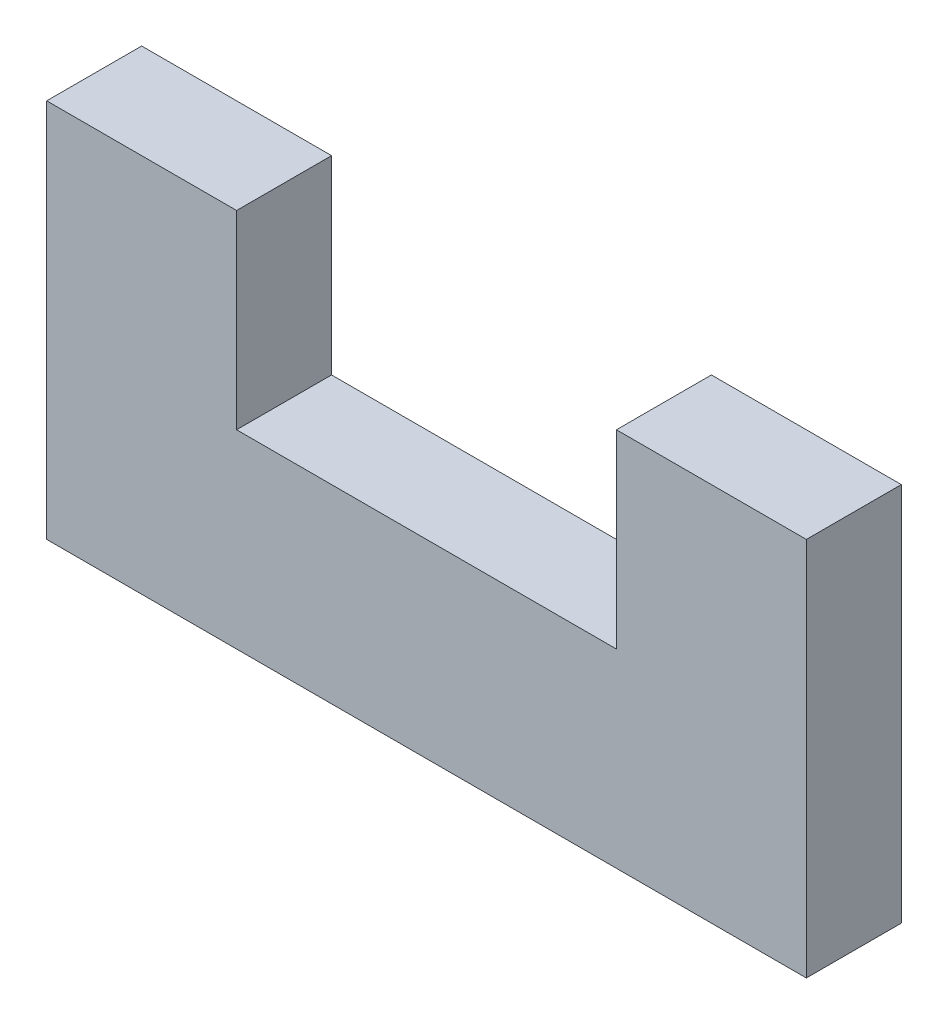
ISO-10303-21;
HEADER;
FILE_DESCRIPTION(('STEP AP214'),'2;1');
FILE_NAME('part.step','',(''),(''),'','','');
FILE_SCHEMA(('AUTOMOTIVE_DESIGN { 1 0 10303 214 1 1 1 1 }'));
ENDSEC;
DATA;
#1=APPLICATION_CONTEXT('core data for automotive mechanical design processes');
#2=APPLICATION_PROTOCOL_DEFINITION('international standard','automotive_design',2000,#1);
#3=PRODUCT_CONTEXT('',#1,'mechanical');
#4=PRODUCT('Part','Part','',(#3));
#5=PRODUCT_RELATED_PRODUCT_CATEGORY('part','',(#4));
#6=PRODUCT_DEFINITION_FORMATION('','',#4);
#7=PRODUCT_DEFINITION_CONTEXT('part definition',#1,'design');
#8=PRODUCT_DEFINITION('design','',#6,#7);
#9=PRODUCT_DEFINITION_SHAPE('','',#8);
#10=(LENGTH_UNIT() NAMED_UNIT(*) SI_UNIT(.MILLI.,.METRE.));
#11=(NAMED_UNIT(*) PLANE_ANGLE_UNIT() SI_UNIT($,.RADIAN.));
#12=(NAMED_UNIT(*) SI_UNIT($,.STERADIAN.) SOLID_ANGLE_UNIT());
#13=UNCERTAINTY_MEASURE_WITH_UNIT(LENGTH_MEASURE(1.E-05),#10,'distance_accuracy_value','');
#14=(GEOMETRIC_REPRESENTATION_CONTEXT(3) GLOBAL_UNCERTAINTY_ASSIGNED_CONTEXT((#13)) GLOBAL_UNIT_ASSIGNED_CONTEXT((#10,
#11,#12)) REPRESENTATION_CONTEXT('',''));
#15=CARTESIAN_POINT('',(0.,0.,0.));
#16=DIRECTION('',(0.,0.,1.));
#17=DIRECTION('',(1.,0.,0.));
#18=AXIS2_PLACEMENT_3D('',#15,#16,#17);
#19=CARTESIAN_POINT('',(3.,1.5,1.5));
#20=DIRECTION('',(1.,0.,0.));
#21=DIRECTION('',(0.,0.,-1.));
#22=AXIS2_PLACEMENT_3D('',#19,#20,#21);
#23=PLANE('',#22);
#24=DIRECTION('',(0.,-1.,0.));
#25=VECTOR('',#24,1.);
#26=CARTESIAN_POINT('',(3.,1.5,0.));
#27=LINE('',#26,#25);
#28=CARTESIAN_POINT('',(3.,1.5,0.));
#29=VERTEX_POINT('',#28);
#30=CARTESIAN_POINT('',(3.,-1.5,0.));
#31=VERTEX_POINT('',#30);
#32=EDGE_CURVE('E129',#29,#31,#27,.T.);
#33=ORIENTED_EDGE('',*,*,#32,.T.);
#34=DIRECTION('',(0.,0.,-1.));
#35=VECTOR('',#34,1.);
#36=CARTESIAN_POINT('',(3.,-1.5,1.5));
#37=LINE('',#36,#35);
#38=CARTESIAN_POINT('',(3.,-1.5,1.5));
#39=VERTEX_POINT('',#38);
#40=EDGE_CURVE('E11',#39,#31,#37,.T.);
#41=ORIENTED_EDGE('',*,*,#40,.F.);
#42=DIRECTION('',(0.,-1.,0.));
#43=VECTOR('',#42,1.);
#44=CARTESIAN_POINT('',(3.,1.5,1.5));
#45=LINE('',#44,#43);
#46=CARTESIAN_POINT('',(3.,1.5,1.5));
#47=VERTEX_POINT('',#46);
#48=EDGE_CURVE('E143',#47,#39,#45,.T.);
#49=ORIENTED_EDGE('',*,*,#48,.F.);
#50=DIRECTION('',(0.,0.,-1.));
#51=VECTOR('',#50,1.);
#52=CARTESIAN_POINT('',(3.,1.5,1.5));
#53=LINE('',#52,#51);
#54=EDGE_CURVE('E125',#47,#29,#53,.T.);
#55=ORIENTED_EDGE('',*,*,#54,.T.);
#56=EDGE_LOOP('',(#33,#41,#49,#55));
#57=FACE_BOUND('',#56,.T.);
#58=ADVANCED_FACE('F33',(#57),#23,.F.);
#59=CARTESIAN_POINT('',(-3.,-1.5,1.5));
#60=DIRECTION('',(0.,-1.,0.));
#61=DIRECTION('',(1.,0.,0.));
#62=AXIS2_PLACEMENT_3D('',#59,#60,#61);
#63=PLANE('',#62);
#64=DIRECTION('',(-1.,0.,0.));
#65=VECTOR('',#64,1.);
#66=CARTESIAN_POINT('',(-3.,-1.5,0.));
#67=LINE('',#66,#65);
#68=CARTESIAN_POINT('',(-3.,-1.5,0.));
#69=VERTEX_POINT('',#68);
#70=EDGE_CURVE('E132',#31,#69,#67,.T.);
#71=ORIENTED_EDGE('',*,*,#70,.T.);
#72=DIRECTION('',(0.,0.,-1.));
#73=VECTOR('',#72,1.);
#74=CARTESIAN_POINT('',(-3.,-1.5,1.5));
#75=LINE('',#74,#73);
#76=CARTESIAN_POINT('',(-3.,-1.5,1.5));
#77=VERTEX_POINT('',#76);
#78=EDGE_CURVE('E41',#77,#69,#75,.T.);
#79=ORIENTED_EDGE('',*,*,#78,.F.);
#80=DIRECTION('',(-1.,0.,0.));
#81=VECTOR('',#80,1.);
#82=CARTESIAN_POINT('',(-3.,-1.5,1.5));
#83=LINE('',#82,#81);
#84=EDGE_CURVE('E92',#39,#77,#83,.T.);
#85=ORIENTED_EDGE('',*,*,#84,.F.);
#86=ORIENTED_EDGE('',*,*,#40,.T.);
#87=EDGE_LOOP('',(#71,#79,#85,#86));
#88=FACE_BOUND('',#87,.T.);
#89=ADVANCED_FACE('F178',(#88),#63,.F.);
#90=CARTESIAN_POINT('',(-3.,1.5,1.5));
#91=DIRECTION('',(-1.,0.,0.));
#92=DIRECTION('',(0.,0.,1.));
#93=AXIS2_PLACEMENT_3D('',#90,#91,#92);
#94=PLANE('',#93);
#95=DIRECTION('',(0.,1.,0.));
#96=VECTOR('',#95,1.);
#97=CARTESIAN_POINT('',(-3.,1.5,0.));
#98=LINE('',#97,#96);
#99=CARTESIAN_POINT('',(-3.,1.5,0.));
#100=VERTEX_POINT('',#99);
#101=EDGE_CURVE('E134',#69,#100,#98,.T.);
#102=ORIENTED_EDGE('',*,*,#101,.T.);
#103=DIRECTION('',(0.,0.,-1.));
#104=VECTOR('',#103,1.);
#105=CARTESIAN_POINT('',(-3.,1.5,1.5));
#106=LINE('',#105,#104);
#107=CARTESIAN_POINT('',(-3.,1.5,1.5));
#108=VERTEX_POINT('',#107);
#109=EDGE_CURVE('E150',#108,#100,#106,.T.);
#110=ORIENTED_EDGE('',*,*,#109,.F.);
#111=DIRECTION('',(0.,1.,0.));
#112=VECTOR('',#111,1.);
#113=CARTESIAN_POINT('',(-3.,1.5,1.5));
#114=LINE('',#113,#112);
#115=EDGE_CURVE('E158',#77,#108,#114,.T.);
#116=ORIENTED_EDGE('',*,*,#115,.F.);
#117=ORIENTED_EDGE('',*,*,#78,.T.);
#118=EDGE_LOOP('',(#102,#110,#116,#117));
#119=FACE_BOUND('',#118,.T.);
#120=ADVANCED_FACE('F156',(#119),#94,.F.);
#121=CARTESIAN_POINT('',(-6.,1.5,1.5));
#122=DIRECTION('',(0.,-1.,0.));
#123=DIRECTION('',(1.,0.,0.));
#124=AXIS2_PLACEMENT_3D('',#121,#122,#123);
#125=PLANE('',#124);
#126=DIRECTION('',(-1.,0.,0.));
#127=VECTOR('',#126,1.);
#128=CARTESIAN_POINT('',(-6.,1.5,0.));
#129=LINE('',#128,#127);
#130=CARTESIAN_POINT('',(-6.,1.5,0.));
#131=VERTEX_POINT('',#130);
#132=EDGE_CURVE('E136',#100,#131,#129,.T.);
#133=ORIENTED_EDGE('',*,*,#132,.T.);
#134=DIRECTION('',(0.,0.,-1.));
#135=VECTOR('',#134,1.);
#136=CARTESIAN_POINT('',(-6.,1.5,1.5));
#137=LINE('',#136,#135);
#138=CARTESIAN_POINT('',(-6.,1.5,1.5));
#139=VERTEX_POINT('',#138);
#140=EDGE_CURVE('E147',#139,#131,#137,.T.);
#141=ORIENTED_EDGE('',*,*,#140,.F.);
#142=DIRECTION('',(-1.,0.,0.));
#143=VECTOR('',#142,1.);
#144=CARTESIAN_POINT('',(-6.,1.5,1.5));
#145=LINE('',#144,#143);
#146=EDGE_CURVE('E170',#108,#139,#145,.T.);
#147=ORIENTED_EDGE('',*,*,#146,.F.);
#148=ORIENTED_EDGE('',*,*,#109,.T.);
#149=EDGE_LOOP('',(#133,#141,#147,#148));
#150=FACE_BOUND('',#149,.T.);
#151=ADVANCED_FACE('F166',(#150),#125,.F.);
#152=CARTESIAN_POINT('',(-6.,1.5,1.5));
#153=DIRECTION('',(1.,0.,0.));
#154=DIRECTION('',(0.,0.,-1.));
#155=AXIS2_PLACEMENT_3D('',#152,#153,#154);
#156=PLANE('',#155);
#157=DIRECTION('',(0.,-1.,0.));
#158=VECTOR('',#157,1.);
#159=CARTESIAN_POINT('',(-6.,1.5,0.));
#160=LINE('',#159,#158);
#161=CARTESIAN_POINT('',(-6.,-4.5,0.));
#162=VERTEX_POINT('',#161);
#163=EDGE_CURVE('E138',#131,#162,#160,.T.);
#164=ORIENTED_EDGE('',*,*,#163,.T.);
#165=DIRECTION('',(0.,0.,-1.));
#166=VECTOR('',#165,1.);
#167=CARTESIAN_POINT('',(-6.,-4.5,1.5));
#168=LINE('',#167,#166);
#169=CARTESIAN_POINT('',(-6.,-4.5,1.5));
#170=VERTEX_POINT('',#169);
#171=EDGE_CURVE('E120',#170,#162,#168,.T.);
#172=ORIENTED_EDGE('',*,*,#171,.F.);
#173=DIRECTION('',(0.,-1.,0.));
#174=VECTOR('',#173,1.);
#175=CARTESIAN_POINT('',(-6.,1.5,1.5));
#176=LINE('',#175,#174);
#177=EDGE_CURVE('E111',#139,#170,#176,.T.);
#178=ORIENTED_EDGE('',*,*,#177,.F.);
#179=ORIENTED_EDGE('',*,*,#140,.T.);
#180=EDGE_LOOP('',(#164,#172,#178,#179));
#181=FACE_BOUND('',#180,.T.);
#182=ADVANCED_FACE('F169',(#181),#156,.F.);
#183=CARTESIAN_POINT('',(-6.,-4.5,1.5));
#184=DIRECTION('',(0.,1.,0.));
#185=DIRECTION('',(-1.,0.,0.));
#186=AXIS2_PLACEMENT_3D('',#183,#184,#185);
#187=PLANE('',#186);
#188=DIRECTION('',(1.,0.,0.));
#189=VECTOR('',#188,1.);
#190=CARTESIAN_POINT('',(-6.,-4.5,0.));
#191=LINE('',#190,#189);
#192=CARTESIAN_POINT('',(6.,-4.5,0.));
#193=VERTEX_POINT('',#192);
#194=EDGE_CURVE('E119',#162,#193,#191,.T.);
#195=ORIENTED_EDGE('',*,*,#194,.T.);
#196=DIRECTION('',(0.,0.,-1.));
#197=VECTOR('',#196,1.);
#198=CARTESIAN_POINT('',(6.,-4.5,1.5));
#199=LINE('',#198,#197);
#200=CARTESIAN_POINT('',(6.,-4.5,1.5));
#201=VERTEX_POINT('',#200);
#202=EDGE_CURVE('E116',#201,#193,#199,.T.);
#203=ORIENTED_EDGE('',*,*,#202,.F.);
#204=DIRECTION('',(1.,0.,0.));
#205=VECTOR('',#204,1.);
#206=CARTESIAN_POINT('',(-6.,-4.5,1.5));
#207=LINE('',#206,#205);
#208=EDGE_CURVE('E105',#170,#201,#207,.T.);
#209=ORIENTED_EDGE('',*,*,#208,.F.);
#210=ORIENTED_EDGE('',*,*,#171,.T.);
#211=EDGE_LOOP('',(#195,#203,#209,#210));
#212=FACE_BOUND('',#211,.T.);
#213=ADVANCED_FACE('F117',(#212),#187,.F.);
#214=CARTESIAN_POINT('',(6.,1.5,1.5));
#215=DIRECTION('',(-1.,0.,0.));
#216=DIRECTION('',(0.,0.,1.));
#217=AXIS2_PLACEMENT_3D('',#214,#215,#216);
#218=PLANE('',#217);
#219=DIRECTION('',(0.,1.,0.));
#220=VECTOR('',#219,1.);
#221=CARTESIAN_POINT('',(6.,1.5,0.));
#222=LINE('',#221,#220);
#223=CARTESIAN_POINT('',(6.,1.5,0.));
#224=VERTEX_POINT('',#223);
#225=EDGE_CURVE('E78',#193,#224,#222,.T.);
#226=ORIENTED_EDGE('',*,*,#225,.T.);
#227=DIRECTION('',(0.,0.,-1.));
#228=VECTOR('',#227,1.);
#229=CARTESIAN_POINT('',(6.,1.5,1.5));
#230=LINE('',#229,#228);
#231=CARTESIAN_POINT('',(6.,1.5,1.5));
#232=VERTEX_POINT('',#231);
#233=EDGE_CURVE('E121',#232,#224,#230,.T.);
#234=ORIENTED_EDGE('',*,*,#233,.F.);
#235=DIRECTION('',(0.,1.,0.));
#236=VECTOR('',#235,1.);
#237=CARTESIAN_POINT('',(6.,1.5,1.5));
#238=LINE('',#237,#236);
#239=EDGE_CURVE('E109',#201,#232,#238,.T.);
#240=ORIENTED_EDGE('',*,*,#239,.F.);
#241=ORIENTED_EDGE('',*,*,#202,.T.);
#242=EDGE_LOOP('',(#226,#234,#240,#241));
#243=FACE_BOUND('',#242,.T.);
#244=ADVANCED_FACE('F123',(#243),#218,.F.);
#245=CARTESIAN_POINT('',(3.,1.5,1.5));
#246=DIRECTION('',(0.,-1.,0.));
#247=DIRECTION('',(1.,0.,0.));
#248=AXIS2_PLACEMENT_3D('',#245,#246,#247);
#249=PLANE('',#248);
#250=DIRECTION('',(-1.,0.,0.));
#251=VECTOR('',#250,1.);
#252=CARTESIAN_POINT('',(3.,1.5,0.));
#253=LINE('',#252,#251);
#254=EDGE_CURVE('E84',#224,#29,#253,.T.);
#255=ORIENTED_EDGE('',*,*,#254,.T.);
#256=ORIENTED_EDGE('',*,*,#54,.F.);
#257=DIRECTION('',(-1.,0.,0.));
#258=VECTOR('',#257,1.);
#259=CARTESIAN_POINT('',(3.,1.5,1.5));
#260=LINE('',#259,#258);
#261=EDGE_CURVE('E49',#232,#47,#260,.T.);
#262=ORIENTED_EDGE('',*,*,#261,.F.);
#263=ORIENTED_EDGE('',*,*,#233,.T.);
#264=EDGE_LOOP('',(#255,#256,#262,#263));
#265=FACE_BOUND('',#264,.T.);
#266=ADVANCED_FACE('F194',(#265),#249,.F.);
#267=CARTESIAN_POINT('',(0.,0.,1.5));
#268=DIRECTION('',(0.,0.,1.));
#269=DIRECTION('',(1.,0.,0.));
#270=AXIS2_PLACEMENT_3D('',#267,#268,#269);
#271=PLANE('',#270);
#272=ORIENTED_EDGE('',*,*,#48,.T.);
#273=ORIENTED_EDGE('',*,*,#84,.T.);
#274=ORIENTED_EDGE('',*,*,#115,.T.);
#275=ORIENTED_EDGE('',*,*,#146,.T.);
#276=ORIENTED_EDGE('',*,*,#177,.T.);
#277=ORIENTED_EDGE('',*,*,#208,.T.);
#278=ORIENTED_EDGE('',*,*,#239,.T.);
#279=ORIENTED_EDGE('',*,*,#261,.T.);
#280=EDGE_LOOP('',(#272,#273,#274,#275,#276,#277,#278,#279));
#281=FACE_BOUND('',#280,.T.);
#282=ADVANCED_FACE('F107',(#281),#271,.T.);
#283=CARTESIAN_POINT('',(0.,0.,0.));
#284=DIRECTION('',(0.,0.,1.));
#285=DIRECTION('',(1.,0.,0.));
#286=AXIS2_PLACEMENT_3D('',#283,#284,#285);
#287=PLANE('',#286);
#288=ORIENTED_EDGE('',*,*,#32,.F.);
#289=ORIENTED_EDGE('',*,*,#254,.F.);
#290=ORIENTED_EDGE('',*,*,#225,.F.);
#291=ORIENTED_EDGE('',*,*,#194,.F.);
#292=ORIENTED_EDGE('',*,*,#163,.F.);
#293=ORIENTED_EDGE('',*,*,#132,.F.);
#294=ORIENTED_EDGE('',*,*,#101,.F.);
#295=ORIENTED_EDGE('',*,*,#70,.F.);
#296=EDGE_LOOP('',(#288,#289,#290,#291,#292,#293,#294,#295));
#297=FACE_BOUND('',#296,.T.);
#298=ADVANCED_FACE('F162',(#297),#287,.F.);
#299=CLOSED_SHELL('',(#58,#89,#120,#151,#182,#213,#244,#266,#282,#298));
#300=MANIFOLD_SOLID_BREP('B2',#299);
#301=ADVANCED_BREP_SHAPE_REPRESENTATION('',(#18,#300),#14);
#302=SHAPE_DEFINITION_REPRESENTATION(#9,#301);
ENDSEC;
END-ISO-10303-21;
